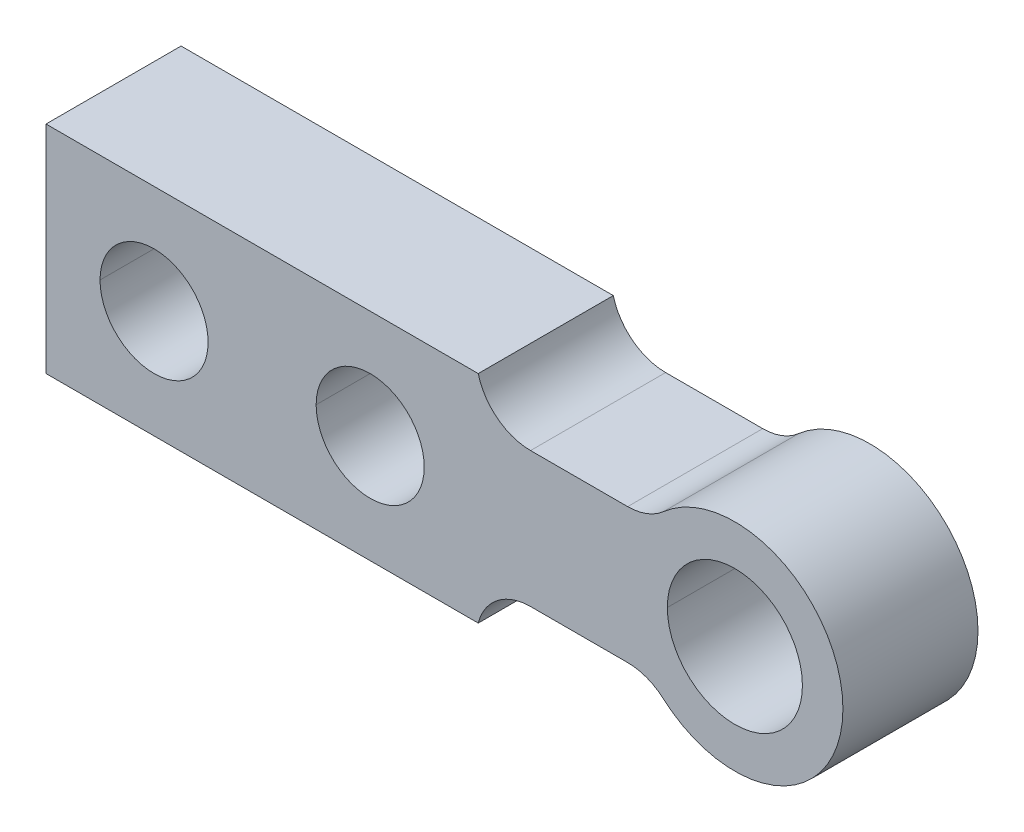
ISO-10303-21;
HEADER;
FILE_DESCRIPTION(('STEP AP214'),'2;1');
FILE_NAME('part.step','',(''),(''),'','','');
FILE_SCHEMA(('AUTOMOTIVE_DESIGN { 1 0 10303 214 1 1 1 1 }'));
ENDSEC;
DATA;
#1=APPLICATION_CONTEXT('core data for automotive mechanical design processes');
#2=APPLICATION_PROTOCOL_DEFINITION('international standard','automotive_design',2000,#1);
#3=PRODUCT_CONTEXT('',#1,'mechanical');
#4=PRODUCT('Part','Part','',(#3));
#5=PRODUCT_RELATED_PRODUCT_CATEGORY('part','',(#4));
#6=PRODUCT_DEFINITION_FORMATION('','',#4);
#7=PRODUCT_DEFINITION_CONTEXT('part definition',#1,'design');
#8=PRODUCT_DEFINITION('design','',#6,#7);
#9=PRODUCT_DEFINITION_SHAPE('','',#8);
#10=(LENGTH_UNIT() NAMED_UNIT(*) SI_UNIT(.MILLI.,.METRE.));
#11=(NAMED_UNIT(*) PLANE_ANGLE_UNIT() SI_UNIT($,.RADIAN.));
#12=(NAMED_UNIT(*) SI_UNIT($,.STERADIAN.) SOLID_ANGLE_UNIT());
#13=UNCERTAINTY_MEASURE_WITH_UNIT(LENGTH_MEASURE(1.E-05),#10,'distance_accuracy_value','');
#14=(GEOMETRIC_REPRESENTATION_CONTEXT(3) GLOBAL_UNCERTAINTY_ASSIGNED_CONTEXT((#13)) GLOBAL_UNIT_ASSIGNED_CONTEXT((#10,
#11,#12)) REPRESENTATION_CONTEXT('',''));
#15=CARTESIAN_POINT('',(0.,0.,0.));
#16=DIRECTION('',(0.,0.,1.));
#17=DIRECTION('',(1.,0.,0.));
#18=AXIS2_PLACEMENT_3D('',#15,#16,#17);
#19=CARTESIAN_POINT('',(9.93649167310371,4.5,5.));
#20=DIRECTION('',(0.,0.,1.));
#21=DIRECTION('',(1.,0.,0.));
#22=AXIS2_PLACEMENT_3D('',#19,#20,#21);
#23=CYLINDRICAL_SURFACE('',#22,2.);
#24=CARTESIAN_POINT('',(9.93649167310371,4.5,5.));
#25=DIRECTION('',(0.,0.,-1.));
#26=DIRECTION('',(1.,0.,0.));
#27=AXIS2_PLACEMENT_3D('',#24,#25,#26);
#28=CIRCLE('',#27,2.);
#29=CARTESIAN_POINT('',(9.93649167310371,2.5,5.));
#30=VERTEX_POINT('',#29);
#31=CARTESIAN_POINT('',(8.,4.,5.));
#32=VERTEX_POINT('',#31);
#33=EDGE_CURVE('E179',#30,#32,#28,.T.);
#34=ORIENTED_EDGE('',*,*,#33,.F.);
#35=DIRECTION('',(0.,0.,1.));
#36=VECTOR('',#35,1.);
#37=CARTESIAN_POINT('',(9.93649167310371,2.5,5.));
#38=LINE('',#37,#36);
#39=CARTESIAN_POINT('',(9.93649167310371,2.5,0.));
#40=VERTEX_POINT('',#39);
#41=EDGE_CURVE('E236',#40,#30,#38,.T.);
#42=ORIENTED_EDGE('',*,*,#41,.F.);
#43=CARTESIAN_POINT('',(9.93649167310371,4.5,0.));
#44=DIRECTION('',(0.,0.,1.));
#45=DIRECTION('',(1.,0.,0.));
#46=AXIS2_PLACEMENT_3D('',#43,#44,#45);
#47=CIRCLE('',#46,2.);
#48=CARTESIAN_POINT('',(8.,4.,0.));
#49=VERTEX_POINT('',#48);
#50=EDGE_CURVE('E178',#49,#40,#47,.T.);
#51=ORIENTED_EDGE('',*,*,#50,.F.);
#52=DIRECTION('',(0.,0.,-1.));
#53=VECTOR('',#52,1.);
#54=CARTESIAN_POINT('',(8.,4.,5.));
#55=LINE('',#54,#53);
#56=EDGE_CURVE('E185',#32,#49,#55,.T.);
#57=ORIENTED_EDGE('',*,*,#56,.F.);
#58=EDGE_LOOP('',(#34,#42,#51,#57));
#59=FACE_BOUND('',#58,.T.);
#60=ADVANCED_FACE('F16',(#59),#23,.F.);
#61=CARTESIAN_POINT('',(13.5313730334031,4.5,5.));
#62=DIRECTION('',(0.,0.,-1.));
#63=DIRECTION('',(-1.,0.,0.));
#64=AXIS2_PLACEMENT_3D('',#61,#62,#63);
#65=CYLINDRICAL_SURFACE('',#64,2.);
#66=CARTESIAN_POINT('',(13.5313730334031,4.5,5.));
#67=DIRECTION('',(0.,0.,-1.));
#68=DIRECTION('',(1.,0.,0.));
#69=AXIS2_PLACEMENT_3D('',#66,#67,#68);
#70=CIRCLE('',#69,2.);
#71=CARTESIAN_POINT('',(14.8542486889354,3.,5.));
#72=VERTEX_POINT('',#71);
#73=CARTESIAN_POINT('',(13.5313730334031,2.5,5.));
#74=VERTEX_POINT('',#73);
#75=EDGE_CURVE('E243',#72,#74,#70,.T.);
#76=ORIENTED_EDGE('',*,*,#75,.F.);
#77=DIRECTION('',(0.,0.,1.));
#78=VECTOR('',#77,1.);
#79=CARTESIAN_POINT('',(14.8542486889354,3.,5.));
#80=LINE('',#79,#78);
#81=CARTESIAN_POINT('',(14.8542486889354,3.,0.));
#82=VERTEX_POINT('',#81);
#83=EDGE_CURVE('E149',#82,#72,#80,.T.);
#84=ORIENTED_EDGE('',*,*,#83,.F.);
#85=CARTESIAN_POINT('',(13.5313730334031,4.5,0.));
#86=DIRECTION('',(0.,0.,1.));
#87=DIRECTION('',(1.,0.,0.));
#88=AXIS2_PLACEMENT_3D('',#85,#86,#87);
#89=CIRCLE('',#88,2.);
#90=CARTESIAN_POINT('',(13.5313730334031,2.5,0.));
#91=VERTEX_POINT('',#90);
#92=EDGE_CURVE('E27',#91,#82,#89,.T.);
#93=ORIENTED_EDGE('',*,*,#92,.F.);
#94=DIRECTION('',(0.,0.,-1.));
#95=VECTOR('',#94,1.);
#96=CARTESIAN_POINT('',(13.5313730334031,2.5,5.));
#97=LINE('',#96,#95);
#98=EDGE_CURVE('E237',#74,#91,#97,.T.);
#99=ORIENTED_EDGE('',*,*,#98,.F.);
#100=EDGE_LOOP('',(#76,#84,#93,#99));
#101=FACE_BOUND('',#100,.T.);
#102=ADVANCED_FACE('F433',(#101),#65,.F.);
#103=CARTESIAN_POINT('',(9.93649167310371,-4.5,5.));
#104=DIRECTION('',(0.,0.,1.));
#105=DIRECTION('',(1.,0.,0.));
#106=AXIS2_PLACEMENT_3D('',#103,#104,#105);
#107=CYLINDRICAL_SURFACE('',#106,2.);
#108=CARTESIAN_POINT('',(9.93649167310371,-4.5,5.));
#109=DIRECTION('',(0.,0.,-1.));
#110=DIRECTION('',(1.,0.,0.));
#111=AXIS2_PLACEMENT_3D('',#108,#109,#110);
#112=CIRCLE('',#111,2.);
#113=CARTESIAN_POINT('',(8.,-4.,5.));
#114=VERTEX_POINT('',#113);
#115=CARTESIAN_POINT('',(9.93649167310371,-2.5,5.));
#116=VERTEX_POINT('',#115);
#117=EDGE_CURVE('E42',#114,#116,#112,.T.);
#118=ORIENTED_EDGE('',*,*,#117,.F.);
#119=DIRECTION('',(0.,0.,-1.));
#120=VECTOR('',#119,1.);
#121=CARTESIAN_POINT('',(8.,-4.,5.));
#122=LINE('',#121,#120);
#123=CARTESIAN_POINT('',(8.,-4.,0.));
#124=VERTEX_POINT('',#123);
#125=EDGE_CURVE('E213',#114,#124,#122,.T.);
#126=ORIENTED_EDGE('',*,*,#125,.T.);
#127=CARTESIAN_POINT('',(9.93649167310371,-4.5,0.));
#128=DIRECTION('',(0.,0.,1.));
#129=DIRECTION('',(1.,0.,0.));
#130=AXIS2_PLACEMENT_3D('',#127,#128,#129);
#131=CIRCLE('',#130,2.);
#132=CARTESIAN_POINT('',(9.93649167310371,-2.5,0.));
#133=VERTEX_POINT('',#132);
#134=EDGE_CURVE('E175',#133,#124,#131,.T.);
#135=ORIENTED_EDGE('',*,*,#134,.F.);
#136=DIRECTION('',(0.,0.,-1.));
#137=VECTOR('',#136,1.);
#138=CARTESIAN_POINT('',(9.93649167310371,-2.5,5.));
#139=LINE('',#138,#137);
#140=EDGE_CURVE('E160',#116,#133,#139,.T.);
#141=ORIENTED_EDGE('',*,*,#140,.F.);
#142=EDGE_LOOP('',(#118,#126,#135,#141));
#143=FACE_BOUND('',#142,.T.);
#144=ADVANCED_FACE('F439',(#143),#107,.F.);
#145=CARTESIAN_POINT('',(13.5313730334031,-4.5,5.));
#146=DIRECTION('',(0.,0.,-1.));
#147=DIRECTION('',(-1.,0.,0.));
#148=AXIS2_PLACEMENT_3D('',#145,#146,#147);
#149=CYLINDRICAL_SURFACE('',#148,2.);
#150=CARTESIAN_POINT('',(13.5313730334031,-4.5,5.));
#151=DIRECTION('',(0.,0.,-1.));
#152=DIRECTION('',(1.,0.,0.));
#153=AXIS2_PLACEMENT_3D('',#150,#151,#152);
#154=CIRCLE('',#153,2.);
#155=CARTESIAN_POINT('',(13.5313730334031,-2.5,5.));
#156=VERTEX_POINT('',#155);
#157=CARTESIAN_POINT('',(14.8542486889354,-3.,5.));
#158=VERTEX_POINT('',#157);
#159=EDGE_CURVE('E167',#156,#158,#154,.T.);
#160=ORIENTED_EDGE('',*,*,#159,.F.);
#161=DIRECTION('',(0.,0.,1.));
#162=VECTOR('',#161,1.);
#163=CARTESIAN_POINT('',(13.5313730334031,-2.5,5.));
#164=LINE('',#163,#162);
#165=CARTESIAN_POINT('',(13.5313730334031,-2.5,0.));
#166=VERTEX_POINT('',#165);
#167=EDGE_CURVE('E138',#166,#156,#164,.T.);
#168=ORIENTED_EDGE('',*,*,#167,.F.);
#169=CARTESIAN_POINT('',(13.5313730334031,-4.5,0.));
#170=DIRECTION('',(0.,0.,1.));
#171=DIRECTION('',(1.,0.,0.));
#172=AXIS2_PLACEMENT_3D('',#169,#170,#171);
#173=CIRCLE('',#172,2.);
#174=CARTESIAN_POINT('',(14.8542486889354,-3.,0.));
#175=VERTEX_POINT('',#174);
#176=EDGE_CURVE('E11',#175,#166,#173,.T.);
#177=ORIENTED_EDGE('',*,*,#176,.F.);
#178=DIRECTION('',(0.,0.,-1.));
#179=VECTOR('',#178,1.);
#180=CARTESIAN_POINT('',(14.8542486889354,-3.,5.));
#181=LINE('',#180,#179);
#182=EDGE_CURVE('E135',#158,#175,#181,.T.);
#183=ORIENTED_EDGE('',*,*,#182,.F.);
#184=EDGE_LOOP('',(#160,#168,#177,#183));
#185=FACE_BOUND('',#184,.T.);
#186=ADVANCED_FACE('F133',(#185),#149,.F.);
#187=CARTESIAN_POINT('',(0.,0.,0.));
#188=DIRECTION('',(0.,0.,1.));
#189=DIRECTION('',(1.,0.,0.));
#190=AXIS2_PLACEMENT_3D('',#187,#188,#189);
#191=PLANE('',#190);
#192=CARTESIAN_POINT('',(17.5,0.,0.));
#193=DIRECTION('',(0.,0.,1.));
#194=DIRECTION('',(1.,0.,0.));
#195=AXIS2_PLACEMENT_3D('',#192,#193,#194);
#196=CIRCLE('',#195,2.5);
#197=CARTESIAN_POINT('',(15.,0.,0.));
#198=VERTEX_POINT('',#197);
#199=CARTESIAN_POINT('',(20.,0.,0.));
#200=VERTEX_POINT('',#199);
#201=EDGE_CURVE('E204',#198,#200,#196,.T.);
#202=ORIENTED_EDGE('',*,*,#201,.T.);
#203=CARTESIAN_POINT('',(17.5,0.,0.));
#204=DIRECTION('',(0.,0.,1.));
#205=DIRECTION('',(1.,0.,0.));
#206=AXIS2_PLACEMENT_3D('',#203,#204,#205);
#207=CIRCLE('',#206,2.5);
#208=EDGE_CURVE('E168',#200,#198,#207,.T.);
#209=ORIENTED_EDGE('',*,*,#208,.T.);
#210=EDGE_LOOP('',(#202,#209));
#211=FACE_BOUND('',#210,.T.);
#212=CARTESIAN_POINT('',(-4.,0.,0.));
#213=DIRECTION('',(0.,0.,1.));
#214=DIRECTION('',(1.,0.,0.));
#215=AXIS2_PLACEMENT_3D('',#212,#213,#214);
#216=CIRCLE('',#215,2.);
#217=CARTESIAN_POINT('',(-6.,0.,0.));
#218=VERTEX_POINT('',#217);
#219=CARTESIAN_POINT('',(-2.,0.,0.));
#220=VERTEX_POINT('',#219);
#221=EDGE_CURVE('E190',#218,#220,#216,.T.);
#222=ORIENTED_EDGE('',*,*,#221,.T.);
#223=CARTESIAN_POINT('',(-4.,0.,0.));
#224=DIRECTION('',(0.,0.,1.));
#225=DIRECTION('',(1.,0.,0.));
#226=AXIS2_PLACEMENT_3D('',#223,#224,#225);
#227=CIRCLE('',#226,2.);
#228=EDGE_CURVE('E217',#220,#218,#227,.T.);
#229=ORIENTED_EDGE('',*,*,#228,.T.);
#230=EDGE_LOOP('',(#222,#229));
#231=FACE_BOUND('',#230,.T.);
#232=CARTESIAN_POINT('',(4.,0.,0.));
#233=DIRECTION('',(0.,0.,1.));
#234=DIRECTION('',(1.,0.,0.));
#235=AXIS2_PLACEMENT_3D('',#232,#233,#234);
#236=CIRCLE('',#235,2.);
#237=CARTESIAN_POINT('',(2.,0.,0.));
#238=VERTEX_POINT('',#237);
#239=CARTESIAN_POINT('',(6.,0.,0.));
#240=VERTEX_POINT('',#239);
#241=EDGE_CURVE('E248',#238,#240,#236,.T.);
#242=ORIENTED_EDGE('',*,*,#241,.T.);
#243=CARTESIAN_POINT('',(4.,0.,0.));
#244=DIRECTION('',(0.,0.,1.));
#245=DIRECTION('',(1.,0.,0.));
#246=AXIS2_PLACEMENT_3D('',#243,#244,#245);
#247=CIRCLE('',#246,2.);
#248=EDGE_CURVE('E169',#240,#238,#247,.T.);
#249=ORIENTED_EDGE('',*,*,#248,.T.);
#250=EDGE_LOOP('',(#242,#249));
#251=FACE_BOUND('',#250,.T.);
#252=DIRECTION('',(1.,0.,0.));
#253=VECTOR('',#252,1.);
#254=CARTESIAN_POINT('',(0.,-2.5,0.));
#255=LINE('',#254,#253);
#256=EDGE_CURVE('E220',#133,#166,#255,.T.);
#257=ORIENTED_EDGE('',*,*,#256,.F.);
#258=ORIENTED_EDGE('',*,*,#134,.T.);
#259=DIRECTION('',(1.,0.,0.));
#260=VECTOR('',#259,1.);
#261=CARTESIAN_POINT('',(0.,-4.,0.));
#262=LINE('',#261,#260);
#263=CARTESIAN_POINT('',(-8.,-4.,0.));
#264=VERTEX_POINT('',#263);
#265=EDGE_CURVE('E221',#264,#124,#262,.T.);
#266=ORIENTED_EDGE('',*,*,#265,.F.);
#267=DIRECTION('',(0.,-1.,0.));
#268=VECTOR('',#267,1.);
#269=CARTESIAN_POINT('',(-8.,0.,0.));
#270=LINE('',#269,#268);
#271=CARTESIAN_POINT('',(-8.,4.,0.));
#272=VERTEX_POINT('',#271);
#273=EDGE_CURVE('E180',#272,#264,#270,.T.);
#274=ORIENTED_EDGE('',*,*,#273,.F.);
#275=DIRECTION('',(1.,0.,0.));
#276=VECTOR('',#275,1.);
#277=CARTESIAN_POINT('',(0.,4.,0.));
#278=LINE('',#277,#276);
#279=EDGE_CURVE('E230',#272,#49,#278,.T.);
#280=ORIENTED_EDGE('',*,*,#279,.T.);
#281=ORIENTED_EDGE('',*,*,#50,.T.);
#282=DIRECTION('',(1.,0.,0.));
#283=VECTOR('',#282,1.);
#284=CARTESIAN_POINT('',(0.,2.5,0.));
#285=LINE('',#284,#283);
#286=EDGE_CURVE('E233',#40,#91,#285,.T.);
#287=ORIENTED_EDGE('',*,*,#286,.T.);
#288=ORIENTED_EDGE('',*,*,#92,.T.);
#289=CARTESIAN_POINT('',(17.5,0.,0.));
#290=DIRECTION('',(0.,0.,1.));
#291=DIRECTION('',(1.,0.,0.));
#292=AXIS2_PLACEMENT_3D('',#289,#290,#291);
#293=CIRCLE('',#292,4.);
#294=EDGE_CURVE('E20',#175,#82,#293,.T.);
#295=ORIENTED_EDGE('',*,*,#294,.F.);
#296=ORIENTED_EDGE('',*,*,#176,.T.);
#297=EDGE_LOOP('',(#257,#258,#266,#274,#280,#281,#287,#288,#295,#296));
#298=FACE_BOUND('',#297,.T.);
#299=ADVANCED_FACE('F143',(#211,#231,#251,#298),#191,.F.);
#300=CARTESIAN_POINT('',(0.,0.,5.));
#301=DIRECTION('',(0.,0.,1.));
#302=DIRECTION('',(1.,0.,0.));
#303=AXIS2_PLACEMENT_3D('',#300,#301,#302);
#304=PLANE('',#303);
#305=CARTESIAN_POINT('',(17.5,0.,5.));
#306=DIRECTION('',(0.,0.,1.));
#307=DIRECTION('',(1.,0.,0.));
#308=AXIS2_PLACEMENT_3D('',#305,#306,#307);
#309=CIRCLE('',#308,2.5);
#310=CARTESIAN_POINT('',(15.,0.,5.));
#311=VERTEX_POINT('',#310);
#312=CARTESIAN_POINT('',(20.,0.,5.));
#313=VERTEX_POINT('',#312);
#314=EDGE_CURVE('E164',#311,#313,#309,.T.);
#315=ORIENTED_EDGE('',*,*,#314,.F.);
#316=CARTESIAN_POINT('',(17.5,0.,5.));
#317=DIRECTION('',(0.,0.,1.));
#318=DIRECTION('',(1.,0.,0.));
#319=AXIS2_PLACEMENT_3D('',#316,#317,#318);
#320=CIRCLE('',#319,2.5);
#321=EDGE_CURVE('E172',#313,#311,#320,.T.);
#322=ORIENTED_EDGE('',*,*,#321,.F.);
#323=EDGE_LOOP('',(#315,#322));
#324=FACE_BOUND('',#323,.T.);
#325=CARTESIAN_POINT('',(-4.,0.,5.));
#326=DIRECTION('',(0.,0.,1.));
#327=DIRECTION('',(1.,0.,0.));
#328=AXIS2_PLACEMENT_3D('',#325,#326,#327);
#329=CIRCLE('',#328,2.);
#330=CARTESIAN_POINT('',(-6.,0.,5.));
#331=VERTEX_POINT('',#330);
#332=CARTESIAN_POINT('',(-2.,0.,5.));
#333=VERTEX_POINT('',#332);
#334=EDGE_CURVE('E191',#331,#333,#329,.T.);
#335=ORIENTED_EDGE('',*,*,#334,.F.);
#336=CARTESIAN_POINT('',(-4.,0.,5.));
#337=DIRECTION('',(0.,0.,1.));
#338=DIRECTION('',(1.,0.,0.));
#339=AXIS2_PLACEMENT_3D('',#336,#337,#338);
#340=CIRCLE('',#339,2.);
#341=EDGE_CURVE('E212',#333,#331,#340,.T.);
#342=ORIENTED_EDGE('',*,*,#341,.F.);
#343=EDGE_LOOP('',(#335,#342));
#344=FACE_BOUND('',#343,.T.);
#345=CARTESIAN_POINT('',(4.,0.,5.));
#346=DIRECTION('',(0.,0.,1.));
#347=DIRECTION('',(1.,0.,0.));
#348=AXIS2_PLACEMENT_3D('',#345,#346,#347);
#349=CIRCLE('',#348,2.);
#350=CARTESIAN_POINT('',(2.,0.,5.));
#351=VERTEX_POINT('',#350);
#352=CARTESIAN_POINT('',(6.,0.,5.));
#353=VERTEX_POINT('',#352);
#354=EDGE_CURVE('E203',#351,#353,#349,.T.);
#355=ORIENTED_EDGE('',*,*,#354,.F.);
#356=CARTESIAN_POINT('',(4.,0.,5.));
#357=DIRECTION('',(0.,0.,1.));
#358=DIRECTION('',(1.,0.,0.));
#359=AXIS2_PLACEMENT_3D('',#356,#357,#358);
#360=CIRCLE('',#359,2.);
#361=EDGE_CURVE('E173',#353,#351,#360,.T.);
#362=ORIENTED_EDGE('',*,*,#361,.F.);
#363=EDGE_LOOP('',(#355,#362));
#364=FACE_BOUND('',#363,.T.);
#365=DIRECTION('',(1.,0.,0.));
#366=VECTOR('',#365,1.);
#367=CARTESIAN_POINT('',(0.,-4.,5.));
#368=LINE('',#367,#366);
#369=CARTESIAN_POINT('',(-8.,-4.,5.));
#370=VERTEX_POINT('',#369);
#371=EDGE_CURVE('E209',#370,#114,#368,.T.);
#372=ORIENTED_EDGE('',*,*,#371,.T.);
#373=ORIENTED_EDGE('',*,*,#117,.T.);
#374=DIRECTION('',(1.,0.,0.));
#375=VECTOR('',#374,1.);
#376=CARTESIAN_POINT('',(0.,-2.5,5.));
#377=LINE('',#376,#375);
#378=EDGE_CURVE('E205',#116,#156,#377,.T.);
#379=ORIENTED_EDGE('',*,*,#378,.T.);
#380=ORIENTED_EDGE('',*,*,#159,.T.);
#381=CARTESIAN_POINT('',(17.5,0.,5.));
#382=DIRECTION('',(0.,0.,1.));
#383=DIRECTION('',(1.,0.,0.));
#384=AXIS2_PLACEMENT_3D('',#381,#382,#383);
#385=CIRCLE('',#384,4.);
#386=EDGE_CURVE('E152',#158,#72,#385,.T.);
#387=ORIENTED_EDGE('',*,*,#386,.T.);
#388=ORIENTED_EDGE('',*,*,#75,.T.);
#389=DIRECTION('',(1.,0.,0.));
#390=VECTOR('',#389,1.);
#391=CARTESIAN_POINT('',(0.,2.5,5.));
#392=LINE('',#391,#390);
#393=EDGE_CURVE('E380',#30,#74,#392,.T.);
#394=ORIENTED_EDGE('',*,*,#393,.F.);
#395=ORIENTED_EDGE('',*,*,#33,.T.);
#396=DIRECTION('',(1.,0.,0.));
#397=VECTOR('',#396,1.);
#398=CARTESIAN_POINT('',(0.,4.,5.));
#399=LINE('',#398,#397);
#400=CARTESIAN_POINT('',(-8.,4.,5.));
#401=VERTEX_POINT('',#400);
#402=EDGE_CURVE('E229',#401,#32,#399,.T.);
#403=ORIENTED_EDGE('',*,*,#402,.F.);
#404=DIRECTION('',(0.,-1.,0.));
#405=VECTOR('',#404,1.);
#406=CARTESIAN_POINT('',(-8.,0.,5.));
#407=LINE('',#406,#405);
#408=EDGE_CURVE('E195',#401,#370,#407,.T.);
#409=ORIENTED_EDGE('',*,*,#408,.T.);
#410=EDGE_LOOP('',(#372,#373,#379,#380,#387,#388,#394,#395,#403,#409));
#411=FACE_BOUND('',#410,.T.);
#412=ADVANCED_FACE('F297',(#324,#344,#364,#411),#304,.T.);
#413=CARTESIAN_POINT('',(17.5,0.,5.));
#414=DIRECTION('',(0.,0.,-1.));
#415=DIRECTION('',(-1.,0.,0.));
#416=AXIS2_PLACEMENT_3D('',#413,#414,#415);
#417=CYLINDRICAL_SURFACE('',#416,2.5);
#418=DIRECTION('',(0.,0.,-1.));
#419=VECTOR('',#418,1.);
#420=CARTESIAN_POINT('',(20.,0.,5.));
#421=LINE('',#420,#419);
#422=EDGE_CURVE('E265',#313,#200,#421,.T.);
#423=ORIENTED_EDGE('',*,*,#422,.F.);
#424=ORIENTED_EDGE('',*,*,#321,.T.);
#425=DIRECTION('',(0.,0.,-1.));
#426=VECTOR('',#425,1.);
#427=CARTESIAN_POINT('',(15.,0.,5.));
#428=LINE('',#427,#426);
#429=EDGE_CURVE('E199',#311,#198,#428,.T.);
#430=ORIENTED_EDGE('',*,*,#429,.T.);
#431=ORIENTED_EDGE('',*,*,#208,.F.);
#432=EDGE_LOOP('',(#423,#424,#430,#431));
#433=FACE_BOUND('',#432,.T.);
#434=ADVANCED_FACE('F335',(#433),#417,.F.);
#435=CARTESIAN_POINT('',(4.,0.,5.));
#436=DIRECTION('',(0.,0.,-1.));
#437=DIRECTION('',(-1.,0.,0.));
#438=AXIS2_PLACEMENT_3D('',#435,#436,#437);
#439=CYLINDRICAL_SURFACE('',#438,2.);
#440=DIRECTION('',(0.,0.,-1.));
#441=VECTOR('',#440,1.);
#442=CARTESIAN_POINT('',(6.,0.,5.));
#443=LINE('',#442,#441);
#444=EDGE_CURVE('E249',#353,#240,#443,.T.);
#445=ORIENTED_EDGE('',*,*,#444,.F.);
#446=ORIENTED_EDGE('',*,*,#361,.T.);
#447=DIRECTION('',(0.,0.,-1.));
#448=VECTOR('',#447,1.);
#449=CARTESIAN_POINT('',(2.,0.,5.));
#450=LINE('',#449,#448);
#451=EDGE_CURVE('E244',#351,#238,#450,.T.);
#452=ORIENTED_EDGE('',*,*,#451,.T.);
#453=ORIENTED_EDGE('',*,*,#248,.F.);
#454=EDGE_LOOP('',(#445,#446,#452,#453));
#455=FACE_BOUND('',#454,.T.);
#456=ADVANCED_FACE('F421',(#455),#439,.F.);
#457=CARTESIAN_POINT('',(-4.,0.,5.));
#458=DIRECTION('',(0.,0.,-1.));
#459=DIRECTION('',(-1.,0.,0.));
#460=AXIS2_PLACEMENT_3D('',#457,#458,#459);
#461=CYLINDRICAL_SURFACE('',#460,2.);
#462=DIRECTION('',(0.,0.,-1.));
#463=VECTOR('',#462,1.);
#464=CARTESIAN_POINT('',(-2.,0.,5.));
#465=LINE('',#464,#463);
#466=EDGE_CURVE('E186',#333,#220,#465,.T.);
#467=ORIENTED_EDGE('',*,*,#466,.F.);
#468=ORIENTED_EDGE('',*,*,#341,.T.);
#469=DIRECTION('',(0.,0.,-1.));
#470=VECTOR('',#469,1.);
#471=CARTESIAN_POINT('',(-6.,0.,5.));
#472=LINE('',#471,#470);
#473=EDGE_CURVE('E261',#331,#218,#472,.T.);
#474=ORIENTED_EDGE('',*,*,#473,.T.);
#475=ORIENTED_EDGE('',*,*,#228,.F.);
#476=EDGE_LOOP('',(#467,#468,#474,#475));
#477=FACE_BOUND('',#476,.T.);
#478=ADVANCED_FACE('F412',(#477),#461,.F.);
#479=CARTESIAN_POINT('',(0.,-4.,5.));
#480=DIRECTION('',(0.,1.,0.));
#481=DIRECTION('',(1.,0.,0.));
#482=AXIS2_PLACEMENT_3D('',#479,#480,#481);
#483=PLANE('',#482);
#484=ORIENTED_EDGE('',*,*,#265,.T.);
#485=ORIENTED_EDGE('',*,*,#125,.F.);
#486=ORIENTED_EDGE('',*,*,#371,.F.);
#487=DIRECTION('',(0.,0.,-1.));
#488=VECTOR('',#487,1.);
#489=CARTESIAN_POINT('',(-8.,-4.,5.));
#490=LINE('',#489,#488);
#491=EDGE_CURVE('E184',#370,#264,#490,.T.);
#492=ORIENTED_EDGE('',*,*,#491,.T.);
#493=EDGE_LOOP('',(#484,#485,#486,#492));
#494=FACE_BOUND('',#493,.T.);
#495=ADVANCED_FACE('F429',(#494),#483,.F.);
#496=CARTESIAN_POINT('',(-8.,0.,5.));
#497=DIRECTION('',(1.,0.,0.));
#498=DIRECTION('',(0.,1.,0.));
#499=AXIS2_PLACEMENT_3D('',#496,#497,#498);
#500=PLANE('',#499);
#501=ORIENTED_EDGE('',*,*,#273,.T.);
#502=ORIENTED_EDGE('',*,*,#491,.F.);
#503=ORIENTED_EDGE('',*,*,#408,.F.);
#504=DIRECTION('',(0.,0.,-1.));
#505=VECTOR('',#504,1.);
#506=CARTESIAN_POINT('',(-8.,4.,5.));
#507=LINE('',#506,#505);
#508=EDGE_CURVE('E225',#401,#272,#507,.T.);
#509=ORIENTED_EDGE('',*,*,#508,.T.);
#510=EDGE_LOOP('',(#501,#502,#503,#509));
#511=FACE_BOUND('',#510,.T.);
#512=ADVANCED_FACE('F446',(#511),#500,.F.);
#513=CARTESIAN_POINT('',(0.,4.,5.));
#514=DIRECTION('',(0.,1.,0.));
#515=DIRECTION('',(1.,0.,0.));
#516=AXIS2_PLACEMENT_3D('',#513,#514,#515);
#517=PLANE('',#516);
#518=ORIENTED_EDGE('',*,*,#279,.F.);
#519=ORIENTED_EDGE('',*,*,#508,.F.);
#520=ORIENTED_EDGE('',*,*,#402,.T.);
#521=ORIENTED_EDGE('',*,*,#56,.T.);
#522=EDGE_LOOP('',(#518,#519,#520,#521));
#523=FACE_BOUND('',#522,.T.);
#524=ADVANCED_FACE('F18',(#523),#517,.T.);
#525=CARTESIAN_POINT('',(0.,2.5,5.));
#526=DIRECTION('',(0.,1.,0.));
#527=DIRECTION('',(1.,0.,0.));
#528=AXIS2_PLACEMENT_3D('',#525,#526,#527);
#529=PLANE('',#528);
#530=ORIENTED_EDGE('',*,*,#393,.T.);
#531=ORIENTED_EDGE('',*,*,#98,.T.);
#532=ORIENTED_EDGE('',*,*,#286,.F.);
#533=ORIENTED_EDGE('',*,*,#41,.T.);
#534=EDGE_LOOP('',(#530,#531,#532,#533));
#535=FACE_BOUND('',#534,.T.);
#536=ADVANCED_FACE('F525',(#535),#529,.T.);
#537=CARTESIAN_POINT('',(17.5,0.,5.));
#538=DIRECTION('',(0.,0.,-1.));
#539=DIRECTION('',(-1.,0.,0.));
#540=AXIS2_PLACEMENT_3D('',#537,#538,#539);
#541=CYLINDRICAL_SURFACE('',#540,4.);
#542=ORIENTED_EDGE('',*,*,#386,.F.);
#543=ORIENTED_EDGE('',*,*,#182,.T.);
#544=ORIENTED_EDGE('',*,*,#294,.T.);
#545=ORIENTED_EDGE('',*,*,#83,.T.);
#546=EDGE_LOOP('',(#542,#543,#544,#545));
#547=FACE_BOUND('',#546,.T.);
#548=ADVANCED_FACE('F150',(#547),#541,.T.);
#549=CARTESIAN_POINT('',(0.,-2.5,5.));
#550=DIRECTION('',(0.,1.,0.));
#551=DIRECTION('',(1.,0.,0.));
#552=AXIS2_PLACEMENT_3D('',#549,#550,#551);
#553=PLANE('',#552);
#554=ORIENTED_EDGE('',*,*,#256,.T.);
#555=ORIENTED_EDGE('',*,*,#167,.T.);
#556=ORIENTED_EDGE('',*,*,#378,.F.);
#557=ORIENTED_EDGE('',*,*,#140,.T.);
#558=EDGE_LOOP('',(#554,#555,#556,#557));
#559=FACE_BOUND('',#558,.T.);
#560=ADVANCED_FACE('F467',(#559),#553,.F.);
#561=CARTESIAN_POINT('',(-4.,0.,5.));
#562=DIRECTION('',(0.,0.,-1.));
#563=DIRECTION('',(-1.,0.,0.));
#564=AXIS2_PLACEMENT_3D('',#561,#562,#563);
#565=CYLINDRICAL_SURFACE('',#564,2.);
#566=ORIENTED_EDGE('',*,*,#334,.T.);
#567=ORIENTED_EDGE('',*,*,#466,.T.);
#568=ORIENTED_EDGE('',*,*,#221,.F.);
#569=ORIENTED_EDGE('',*,*,#473,.F.);
#570=EDGE_LOOP('',(#566,#567,#568,#569));
#571=FACE_BOUND('',#570,.T.);
#572=ADVANCED_FACE('F415',(#571),#565,.F.);
#573=CARTESIAN_POINT('',(4.,0.,5.));
#574=DIRECTION('',(0.,0.,-1.));
#575=DIRECTION('',(-1.,0.,0.));
#576=AXIS2_PLACEMENT_3D('',#573,#574,#575);
#577=CYLINDRICAL_SURFACE('',#576,2.);
#578=ORIENTED_EDGE('',*,*,#354,.T.);
#579=ORIENTED_EDGE('',*,*,#444,.T.);
#580=ORIENTED_EDGE('',*,*,#241,.F.);
#581=ORIENTED_EDGE('',*,*,#451,.F.);
#582=EDGE_LOOP('',(#578,#579,#580,#581));
#583=FACE_BOUND('',#582,.T.);
#584=ADVANCED_FACE('F293',(#583),#577,.F.);
#585=CARTESIAN_POINT('',(17.5,0.,5.));
#586=DIRECTION('',(0.,0.,-1.));
#587=DIRECTION('',(-1.,0.,0.));
#588=AXIS2_PLACEMENT_3D('',#585,#586,#587);
#589=CYLINDRICAL_SURFACE('',#588,2.5);
#590=ORIENTED_EDGE('',*,*,#314,.T.);
#591=ORIENTED_EDGE('',*,*,#422,.T.);
#592=ORIENTED_EDGE('',*,*,#201,.F.);
#593=ORIENTED_EDGE('',*,*,#429,.F.);
#594=EDGE_LOOP('',(#590,#591,#592,#593));
#595=FACE_BOUND('',#594,.T.);
#596=ADVANCED_FACE('F341',(#595),#589,.F.);
#597=CLOSED_SHELL('',(#60,#102,#144,#186,#299,#412,#434,#456,#478,#495,#512,#524,#536,#548,#560,
#572,#584,#596));
#598=MANIFOLD_SOLID_BREP('B1',#597);
#599=ADVANCED_BREP_SHAPE_REPRESENTATION('',(#18,#598),#14);
#600=SHAPE_DEFINITION_REPRESENTATION(#9,#599);
ENDSEC;
END-ISO-10303-21;
